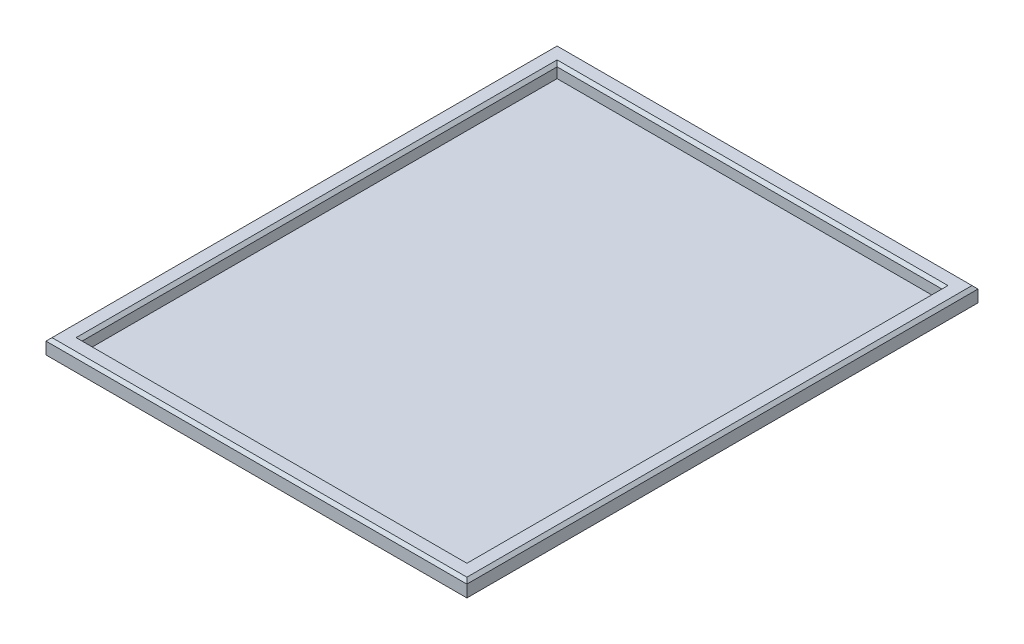
ISO-10303-21;
HEADER;
FILE_DESCRIPTION(('STEP AP214'),'2;1');
FILE_NAME('part.step','',(''),(''),'','','');
FILE_SCHEMA(('AUTOMOTIVE_DESIGN { 1 0 10303 214 1 1 1 1 }'));
ENDSEC;
DATA;
#1=APPLICATION_CONTEXT('core data for automotive mechanical design processes');
#2=APPLICATION_PROTOCOL_DEFINITION('international standard','automotive_design',2000,#1);
#3=PRODUCT_CONTEXT('',#1,'mechanical');
#4=PRODUCT('Part','Part','',(#3));
#5=PRODUCT_RELATED_PRODUCT_CATEGORY('part','',(#4));
#6=PRODUCT_DEFINITION_FORMATION('','',#4);
#7=PRODUCT_DEFINITION_CONTEXT('part definition',#1,'design');
#8=PRODUCT_DEFINITION('design','',#6,#7);
#9=PRODUCT_DEFINITION_SHAPE('','',#8);
#10=(LENGTH_UNIT() NAMED_UNIT(*) SI_UNIT(.MILLI.,.METRE.));
#11=(NAMED_UNIT(*) PLANE_ANGLE_UNIT() SI_UNIT($,.RADIAN.));
#12=(NAMED_UNIT(*) SI_UNIT($,.STERADIAN.) SOLID_ANGLE_UNIT());
#13=UNCERTAINTY_MEASURE_WITH_UNIT(LENGTH_MEASURE(1.E-05),#10,'distance_accuracy_value','');
#14=(GEOMETRIC_REPRESENTATION_CONTEXT(3) GLOBAL_UNCERTAINTY_ASSIGNED_CONTEXT((#13)) GLOBAL_UNIT_ASSIGNED_CONTEXT((#10,
#11,#12)) REPRESENTATION_CONTEXT('',''));
#15=CARTESIAN_POINT('',(0.,0.,0.));
#16=DIRECTION('',(0.,0.,1.));
#17=DIRECTION('',(1.,0.,0.));
#18=AXIS2_PLACEMENT_3D('',#15,#16,#17);
#19=CARTESIAN_POINT('',(-320.,8.,395.));
#20=DIRECTION('',(0.,0.,1.));
#21=DIRECTION('',(1.,0.,0.));
#22=AXIS2_PLACEMENT_3D('',#19,#20,#21);
#23=PLANE('',#22);
#24=DIRECTION('',(-1.,0.,0.));
#25=VECTOR('',#24,1.);
#26=CARTESIAN_POINT('',(-320.,0.,395.));
#27=LINE('',#26,#25);
#28=CARTESIAN_POINT('',(320.,0.,395.));
#29=VERTEX_POINT('',#28);
#30=CARTESIAN_POINT('',(-320.,0.,395.));
#31=VERTEX_POINT('',#30);
#32=EDGE_CURVE('E111',#29,#31,#27,.T.);
#33=ORIENTED_EDGE('',*,*,#32,.F.);
#34=DIRECTION('',(0.,-1.,0.));
#35=VECTOR('',#34,1.);
#36=CARTESIAN_POINT('',(320.,8.,395.));
#37=LINE('',#36,#35);
#38=CARTESIAN_POINT('',(320.,8.,395.));
#39=VERTEX_POINT('',#38);
#40=EDGE_CURVE('E12',#39,#29,#37,.T.);
#41=ORIENTED_EDGE('',*,*,#40,.F.);
#42=DIRECTION('',(-1.,0.,0.));
#43=VECTOR('',#42,1.);
#44=CARTESIAN_POINT('',(-320.,8.,395.));
#45=LINE('',#44,#43);
#46=CARTESIAN_POINT('',(-320.,8.,395.));
#47=VERTEX_POINT('',#46);
#48=EDGE_CURVE('E105',#39,#47,#45,.T.);
#49=ORIENTED_EDGE('',*,*,#48,.T.);
#50=DIRECTION('',(0.,-1.,0.));
#51=VECTOR('',#50,1.);
#52=CARTESIAN_POINT('',(-320.,8.,395.));
#53=LINE('',#52,#51);
#54=EDGE_CURVE('E50',#47,#31,#53,.T.);
#55=ORIENTED_EDGE('',*,*,#54,.T.);
#56=EDGE_LOOP('',(#33,#41,#49,#55));
#57=FACE_BOUND('',#56,.T.);
#58=ADVANCED_FACE('F47',(#57),#23,.T.);
#59=CARTESIAN_POINT('',(320.,8.,395.));
#60=DIRECTION('',(1.,0.,0.));
#61=DIRECTION('',(0.,0.,-1.));
#62=AXIS2_PLACEMENT_3D('',#59,#60,#61);
#63=PLANE('',#62);
#64=DIRECTION('',(0.,0.,1.));
#65=VECTOR('',#64,1.);
#66=CARTESIAN_POINT('',(320.,0.,395.));
#67=LINE('',#66,#65);
#68=CARTESIAN_POINT('',(320.,0.,-395.));
#69=VERTEX_POINT('',#68);
#70=EDGE_CURVE('E107',#69,#29,#67,.T.);
#71=ORIENTED_EDGE('',*,*,#70,.F.);
#72=DIRECTION('',(0.,-1.,0.));
#73=VECTOR('',#72,1.);
#74=CARTESIAN_POINT('',(320.,8.,-395.));
#75=LINE('',#74,#73);
#76=CARTESIAN_POINT('',(320.,8.,-395.));
#77=VERTEX_POINT('',#76);
#78=EDGE_CURVE('E56',#77,#69,#75,.T.);
#79=ORIENTED_EDGE('',*,*,#78,.F.);
#80=DIRECTION('',(0.,0.,1.));
#81=VECTOR('',#80,1.);
#82=CARTESIAN_POINT('',(320.,8.,395.));
#83=LINE('',#82,#81);
#84=EDGE_CURVE('E102',#77,#39,#83,.T.);
#85=ORIENTED_EDGE('',*,*,#84,.T.);
#86=ORIENTED_EDGE('',*,*,#40,.T.);
#87=EDGE_LOOP('',(#71,#79,#85,#86));
#88=FACE_BOUND('',#87,.T.);
#89=ADVANCED_FACE('F121',(#88),#63,.T.);
#90=CARTESIAN_POINT('',(320.,8.,-395.));
#91=DIRECTION('',(0.,0.,-1.));
#92=DIRECTION('',(-1.,0.,0.));
#93=AXIS2_PLACEMENT_3D('',#90,#91,#92);
#94=PLANE('',#93);
#95=DIRECTION('',(1.,0.,0.));
#96=VECTOR('',#95,1.);
#97=CARTESIAN_POINT('',(320.,0.,-395.));
#98=LINE('',#97,#96);
#99=CARTESIAN_POINT('',(-320.,0.,-395.));
#100=VERTEX_POINT('',#99);
#101=EDGE_CURVE('E97',#100,#69,#98,.T.);
#102=ORIENTED_EDGE('',*,*,#101,.F.);
#103=DIRECTION('',(0.,-1.,0.));
#104=VECTOR('',#103,1.);
#105=CARTESIAN_POINT('',(-320.,8.,-395.));
#106=LINE('',#105,#104);
#107=CARTESIAN_POINT('',(-320.,8.,-395.));
#108=VERTEX_POINT('',#107);
#109=EDGE_CURVE('E92',#108,#100,#106,.T.);
#110=ORIENTED_EDGE('',*,*,#109,.F.);
#111=DIRECTION('',(1.,0.,0.));
#112=VECTOR('',#111,1.);
#113=CARTESIAN_POINT('',(320.,8.,-395.));
#114=LINE('',#113,#112);
#115=EDGE_CURVE('E95',#108,#77,#114,.T.);
#116=ORIENTED_EDGE('',*,*,#115,.T.);
#117=ORIENTED_EDGE('',*,*,#78,.T.);
#118=EDGE_LOOP('',(#102,#110,#116,#117));
#119=FACE_BOUND('',#118,.T.);
#120=ADVANCED_FACE('F94',(#119),#94,.T.);
#121=CARTESIAN_POINT('',(-320.,8.,-395.));
#122=DIRECTION('',(-1.,0.,0.));
#123=DIRECTION('',(0.,0.,1.));
#124=AXIS2_PLACEMENT_3D('',#121,#122,#123);
#125=PLANE('',#124);
#126=DIRECTION('',(0.,0.,-1.));
#127=VECTOR('',#126,1.);
#128=CARTESIAN_POINT('',(-320.,0.,-395.));
#129=LINE('',#128,#127);
#130=EDGE_CURVE('E114',#31,#100,#129,.T.);
#131=ORIENTED_EDGE('',*,*,#130,.F.);
#132=ORIENTED_EDGE('',*,*,#54,.F.);
#133=DIRECTION('',(0.,0.,-1.));
#134=VECTOR('',#133,1.);
#135=CARTESIAN_POINT('',(-320.,8.,-395.));
#136=LINE('',#135,#134);
#137=EDGE_CURVE('E101',#47,#108,#136,.T.);
#138=ORIENTED_EDGE('',*,*,#137,.T.);
#139=ORIENTED_EDGE('',*,*,#109,.T.);
#140=EDGE_LOOP('',(#131,#132,#138,#139));
#141=FACE_BOUND('',#140,.T.);
#142=ADVANCED_FACE('F104',(#141),#125,.T.);
#143=CARTESIAN_POINT('',(0.,8.,0.));
#144=DIRECTION('',(0.,1.,0.));
#145=DIRECTION('',(0.,0.,1.));
#146=AXIS2_PLACEMENT_3D('',#143,#144,#145);
#147=PLANE('',#146);
#148=ORIENTED_EDGE('',*,*,#48,.F.);
#149=ORIENTED_EDGE('',*,*,#84,.F.);
#150=ORIENTED_EDGE('',*,*,#115,.F.);
#151=ORIENTED_EDGE('',*,*,#137,.F.);
#152=EDGE_LOOP('',(#148,#149,#150,#151));
#153=FACE_BOUND('',#152,.T.);
#154=ADVANCED_FACE('F100',(#153),#147,.T.);
#155=CARTESIAN_POINT('',(0.,0.,0.));
#156=DIRECTION('',(0.,1.,0.));
#157=DIRECTION('',(0.,0.,1.));
#158=AXIS2_PLACEMENT_3D('',#155,#156,#157);
#159=PLANE('',#158);
#160=ORIENTED_EDGE('',*,*,#32,.T.);
#161=ORIENTED_EDGE('',*,*,#130,.T.);
#162=ORIENTED_EDGE('',*,*,#101,.T.);
#163=ORIENTED_EDGE('',*,*,#70,.T.);
#164=EDGE_LOOP('',(#160,#161,#162,#163));
#165=FACE_BOUND('',#164,.T.);
#166=ADVANCED_FACE('F120',(#165),#159,.F.);
#167=CLOSED_SHELL('',(#58,#89,#120,#142,#154,#166));
#168=MANIFOLD_SOLID_BREP('B2',#167);
#169=CARTESIAN_POINT('',(0.,30.,0.));
#170=DIRECTION('',(0.,-1.,0.));
#171=DIRECTION('',(0.,0.,-1.));
#172=AXIS2_PLACEMENT_3D('',#169,#170,#171);
#173=PLANE('',#172);
#174=DIRECTION('',(0.,0.,1.));
#175=VECTOR('',#174,1.);
#176=CARTESIAN_POINT('',(325.,30.,395.));
#177=LINE('',#176,#175);
#178=CARTESIAN_POINT('',(325.,30.,-400.));
#179=VERTEX_POINT('',#178);
#180=CARTESIAN_POINT('',(325.,30.,400.));
#181=VERTEX_POINT('',#180);
#182=EDGE_CURVE('E339',#179,#181,#177,.T.);
#183=ORIENTED_EDGE('',*,*,#182,.T.);
#184=DIRECTION('',(-1.,0.,0.));
#185=VECTOR('',#184,1.);
#186=CARTESIAN_POINT('',(-320.,30.,400.));
#187=LINE('',#186,#185);
#188=CARTESIAN_POINT('',(-325.,30.,400.));
#189=VERTEX_POINT('',#188);
#190=EDGE_CURVE('E341',#181,#189,#187,.T.);
#191=ORIENTED_EDGE('',*,*,#190,.T.);
#192=DIRECTION('',(0.,0.,-1.));
#193=VECTOR('',#192,1.);
#194=CARTESIAN_POINT('',(-325.,30.,-395.));
#195=LINE('',#194,#193);
#196=CARTESIAN_POINT('',(-325.,30.,-400.));
#197=VERTEX_POINT('',#196);
#198=EDGE_CURVE('E335',#189,#197,#195,.T.);
#199=ORIENTED_EDGE('',*,*,#198,.T.);
#200=DIRECTION('',(1.,0.,0.));
#201=VECTOR('',#200,1.);
#202=CARTESIAN_POINT('',(320.,30.,-400.));
#203=LINE('',#202,#201);
#204=EDGE_CURVE('E337',#197,#179,#203,.T.);
#205=ORIENTED_EDGE('',*,*,#204,.T.);
#206=EDGE_LOOP('',(#183,#191,#199,#205));
#207=FACE_BOUND('',#206,.T.);
#208=DIRECTION('',(0.,0.,1.));
#209=VECTOR('',#208,1.);
#210=CARTESIAN_POINT('',(-345.,30.,0.));
#211=LINE('',#210,#209);
#212=CARTESIAN_POINT('',(-345.,30.,-420.));
#213=VERTEX_POINT('',#212);
#214=CARTESIAN_POINT('',(-345.,30.,420.));
#215=VERTEX_POINT('',#214);
#216=EDGE_CURVE('E330',#213,#215,#211,.T.);
#217=ORIENTED_EDGE('',*,*,#216,.T.);
#218=DIRECTION('',(1.,0.,0.));
#219=VECTOR('',#218,1.);
#220=CARTESIAN_POINT('',(0.,30.,420.));
#221=LINE('',#220,#219);
#222=CARTESIAN_POINT('',(345.,30.,420.));
#223=VERTEX_POINT('',#222);
#224=EDGE_CURVE('E332',#215,#223,#221,.T.);
#225=ORIENTED_EDGE('',*,*,#224,.T.);
#226=DIRECTION('',(0.,0.,-1.));
#227=VECTOR('',#226,1.);
#228=CARTESIAN_POINT('',(345.,30.,0.));
#229=LINE('',#228,#227);
#230=CARTESIAN_POINT('',(345.,30.,-420.));
#231=VERTEX_POINT('',#230);
#232=EDGE_CURVE('E326',#223,#231,#229,.T.);
#233=ORIENTED_EDGE('',*,*,#232,.T.);
#234=DIRECTION('',(-1.,0.,0.));
#235=VECTOR('',#234,1.);
#236=CARTESIAN_POINT('',(0.,30.,-420.));
#237=LINE('',#236,#235);
#238=EDGE_CURVE('E328',#231,#213,#237,.T.);
#239=ORIENTED_EDGE('',*,*,#238,.T.);
#240=EDGE_LOOP('',(#217,#225,#233,#239));
#241=FACE_BOUND('',#240,.T.);
#242=ADVANCED_FACE('F171',(#207,#241),#173,.F.);
#243=CARTESIAN_POINT('',(0.,0.,0.));
#244=DIRECTION('',(0.,-1.,0.));
#245=DIRECTION('',(0.,0.,-1.));
#246=AXIS2_PLACEMENT_3D('',#243,#244,#245);
#247=PLANE('',#246);
#248=DIRECTION('',(1.,0.,0.));
#249=VECTOR('',#248,1.);
#250=CARTESIAN_POINT('',(350.,0.,-420.));
#251=LINE('',#250,#249);
#252=CARTESIAN_POINT('',(-345.,0.,-420.));
#253=VERTEX_POINT('',#252);
#254=CARTESIAN_POINT('',(345.,0.,-420.));
#255=VERTEX_POINT('',#254);
#256=EDGE_CURVE('E181',#253,#255,#251,.T.);
#257=ORIENTED_EDGE('',*,*,#256,.T.);
#258=DIRECTION('',(0.,0.,1.));
#259=VECTOR('',#258,1.);
#260=CARTESIAN_POINT('',(345.,0.,425.));
#261=LINE('',#260,#259);
#262=CARTESIAN_POINT('',(345.,0.,420.));
#263=VERTEX_POINT('',#262);
#264=EDGE_CURVE('E45',#255,#263,#261,.T.);
#265=ORIENTED_EDGE('',*,*,#264,.T.);
#266=DIRECTION('',(-1.,0.,0.));
#267=VECTOR('',#266,1.);
#268=CARTESIAN_POINT('',(-350.,0.,420.));
#269=LINE('',#268,#267);
#270=CARTESIAN_POINT('',(-345.,0.,420.));
#271=VERTEX_POINT('',#270);
#272=EDGE_CURVE('E367',#263,#271,#269,.T.);
#273=ORIENTED_EDGE('',*,*,#272,.T.);
#274=DIRECTION('',(0.,0.,-1.));
#275=VECTOR('',#274,1.);
#276=CARTESIAN_POINT('',(-345.,0.,-425.));
#277=LINE('',#276,#275);
#278=EDGE_CURVE('E192',#271,#253,#277,.T.);
#279=ORIENTED_EDGE('',*,*,#278,.T.);
#280=EDGE_LOOP('',(#257,#265,#273,#279));
#281=FACE_BOUND('',#280,.T.);
#282=DIRECTION('',(-1.,0.,0.));
#283=VECTOR('',#282,1.);
#284=CARTESIAN_POINT('',(-320.,0.,-395.));
#285=LINE('',#284,#283);
#286=CARTESIAN_POINT('',(320.,0.,-395.));
#287=VERTEX_POINT('',#286);
#288=CARTESIAN_POINT('',(-320.,0.,-395.));
#289=VERTEX_POINT('',#288);
#290=EDGE_CURVE('E299',#287,#289,#285,.T.);
#291=ORIENTED_EDGE('',*,*,#290,.T.);
#292=DIRECTION('',(0.,0.,1.));
#293=VECTOR('',#292,1.);
#294=CARTESIAN_POINT('',(-320.,0.,395.));
#295=LINE('',#294,#293);
#296=CARTESIAN_POINT('',(-320.,0.,395.));
#297=VERTEX_POINT('',#296);
#298=EDGE_CURVE('E278',#289,#297,#295,.T.);
#299=ORIENTED_EDGE('',*,*,#298,.T.);
#300=DIRECTION('',(1.,0.,0.));
#301=VECTOR('',#300,1.);
#302=CARTESIAN_POINT('',(-320.,0.,395.));
#303=LINE('',#302,#301);
#304=CARTESIAN_POINT('',(320.,0.,395.));
#305=VERTEX_POINT('',#304);
#306=EDGE_CURVE('E289',#297,#305,#303,.T.);
#307=ORIENTED_EDGE('',*,*,#306,.T.);
#308=DIRECTION('',(0.,0.,-1.));
#309=VECTOR('',#308,1.);
#310=CARTESIAN_POINT('',(320.,0.,395.));
#311=LINE('',#310,#309);
#312=EDGE_CURVE('E295',#305,#287,#311,.T.);
#313=ORIENTED_EDGE('',*,*,#312,.T.);
#314=EDGE_LOOP('',(#291,#299,#307,#313));
#315=FACE_BOUND('',#314,.T.);
#316=ADVANCED_FACE('F297',(#281,#315),#247,.T.);
#317=CARTESIAN_POINT('',(350.,30.,425.));
#318=DIRECTION('',(-1.,0.,0.));
#319=DIRECTION('',(0.,0.,1.));
#320=AXIS2_PLACEMENT_3D('',#317,#318,#319);
#321=PLANE('',#320);
#322=DIRECTION('',(0.,-1.,0.));
#323=VECTOR('',#322,1.);
#324=CARTESIAN_POINT('',(350.,30.,-425.));
#325=LINE('',#324,#323);
#326=CARTESIAN_POINT('',(350.,24.9999999999998,-425.));
#327=VERTEX_POINT('',#326);
#328=CARTESIAN_POINT('',(350.,5.,-425.));
#329=VERTEX_POINT('',#328);
#330=EDGE_CURVE('E321',#327,#329,#325,.T.);
#331=ORIENTED_EDGE('',*,*,#330,.F.);
#332=DIRECTION('',(0.,0.,1.));
#333=VECTOR('',#332,1.);
#334=CARTESIAN_POINT('',(350.,24.9999999999998,425.));
#335=LINE('',#334,#333);
#336=CARTESIAN_POINT('',(350.,24.9999999999998,425.));
#337=VERTEX_POINT('',#336);
#338=EDGE_CURVE('E365',#327,#337,#335,.T.);
#339=ORIENTED_EDGE('',*,*,#338,.T.);
#340=DIRECTION('',(0.,-1.,0.));
#341=VECTOR('',#340,1.);
#342=CARTESIAN_POINT('',(350.,30.,425.));
#343=LINE('',#342,#341);
#344=CARTESIAN_POINT('',(350.,5.,425.));
#345=VERTEX_POINT('',#344);
#346=EDGE_CURVE('E285',#337,#345,#343,.T.);
#347=ORIENTED_EDGE('',*,*,#346,.T.);
#348=DIRECTION('',(0.,0.,-1.));
#349=VECTOR('',#348,1.);
#350=CARTESIAN_POINT('',(350.,5.,-425.));
#351=LINE('',#350,#349);
#352=EDGE_CURVE('E362',#345,#329,#351,.T.);
#353=ORIENTED_EDGE('',*,*,#352,.T.);
#354=EDGE_LOOP('',(#331,#339,#347,#353));
#355=FACE_BOUND('',#354,.T.);
#356=ADVANCED_FACE('F409',(#355),#321,.F.);
#357=CARTESIAN_POINT('',(-350.,30.,-425.));
#358=DIRECTION('',(0.,0.,1.));
#359=DIRECTION('',(1.,0.,0.));
#360=AXIS2_PLACEMENT_3D('',#357,#358,#359);
#361=PLANE('',#360);
#362=DIRECTION('',(0.,-1.,0.));
#363=VECTOR('',#362,1.);
#364=CARTESIAN_POINT('',(-350.,30.,-425.));
#365=LINE('',#364,#363);
#366=CARTESIAN_POINT('',(-350.,24.9999999999998,-425.));
#367=VERTEX_POINT('',#366);
#368=CARTESIAN_POINT('',(-350.,5.,-425.));
#369=VERTEX_POINT('',#368);
#370=EDGE_CURVE('E318',#367,#369,#365,.T.);
#371=ORIENTED_EDGE('',*,*,#370,.F.);
#372=DIRECTION('',(1.,0.,0.));
#373=VECTOR('',#372,1.);
#374=CARTESIAN_POINT('',(-350.,24.9999999999998,-425.));
#375=LINE('',#374,#373);
#376=EDGE_CURVE('E360',#367,#327,#375,.T.);
#377=ORIENTED_EDGE('',*,*,#376,.T.);
#378=ORIENTED_EDGE('',*,*,#330,.T.);
#379=DIRECTION('',(-1.,0.,0.));
#380=VECTOR('',#379,1.);
#381=CARTESIAN_POINT('',(-350.,5.,-425.));
#382=LINE('',#381,#380);
#383=EDGE_CURVE('E358',#329,#369,#382,.T.);
#384=ORIENTED_EDGE('',*,*,#383,.T.);
#385=EDGE_LOOP('',(#371,#377,#378,#384));
#386=FACE_BOUND('',#385,.T.);
#387=ADVANCED_FACE('F415',(#386),#361,.F.);
#388=CARTESIAN_POINT('',(-350.,30.,425.));
#389=DIRECTION('',(1.,0.,0.));
#390=DIRECTION('',(0.,0.,-1.));
#391=AXIS2_PLACEMENT_3D('',#388,#389,#390);
#392=PLANE('',#391);
#393=DIRECTION('',(0.,-1.,0.));
#394=VECTOR('',#393,1.);
#395=CARTESIAN_POINT('',(-350.,30.,425.));
#396=LINE('',#395,#394);
#397=CARTESIAN_POINT('',(-350.,24.9999999999998,425.));
#398=VERTEX_POINT('',#397);
#399=CARTESIAN_POINT('',(-350.,5.,425.));
#400=VERTEX_POINT('',#399);
#401=EDGE_CURVE('E315',#398,#400,#396,.T.);
#402=ORIENTED_EDGE('',*,*,#401,.F.);
#403=DIRECTION('',(0.,0.,-1.));
#404=VECTOR('',#403,1.);
#405=CARTESIAN_POINT('',(-350.,24.9999999999998,425.));
#406=LINE('',#405,#404);
#407=EDGE_CURVE('E356',#398,#367,#406,.T.);
#408=ORIENTED_EDGE('',*,*,#407,.T.);
#409=ORIENTED_EDGE('',*,*,#370,.T.);
#410=DIRECTION('',(0.,0.,1.));
#411=VECTOR('',#410,1.);
#412=CARTESIAN_POINT('',(-350.,5.,425.));
#413=LINE('',#412,#411);
#414=EDGE_CURVE('E354',#369,#400,#413,.T.);
#415=ORIENTED_EDGE('',*,*,#414,.T.);
#416=EDGE_LOOP('',(#402,#408,#409,#415));
#417=FACE_BOUND('',#416,.T.);
#418=ADVANCED_FACE('F425',(#417),#392,.F.);
#419=CARTESIAN_POINT('',(-350.,30.,425.));
#420=DIRECTION('',(0.,0.,-1.));
#421=DIRECTION('',(-1.,0.,0.));
#422=AXIS2_PLACEMENT_3D('',#419,#420,#421);
#423=PLANE('',#422);
#424=ORIENTED_EDGE('',*,*,#346,.F.);
#425=DIRECTION('',(-1.,0.,0.));
#426=VECTOR('',#425,1.);
#427=CARTESIAN_POINT('',(-350.,24.9999999999998,425.));
#428=LINE('',#427,#426);
#429=EDGE_CURVE('E351',#337,#398,#428,.T.);
#430=ORIENTED_EDGE('',*,*,#429,.T.);
#431=ORIENTED_EDGE('',*,*,#401,.T.);
#432=DIRECTION('',(1.,0.,0.));
#433=VECTOR('',#432,1.);
#434=CARTESIAN_POINT('',(350.,5.,425.));
#435=LINE('',#434,#433);
#436=EDGE_CURVE('E349',#400,#345,#435,.T.);
#437=ORIENTED_EDGE('',*,*,#436,.T.);
#438=EDGE_LOOP('',(#424,#430,#431,#437));
#439=FACE_BOUND('',#438,.T.);
#440=ADVANCED_FACE('F422',(#439),#423,.F.);
#441=CARTESIAN_POINT('',(-320.,30.,395.));
#442=DIRECTION('',(1.,0.,0.));
#443=DIRECTION('',(0.,0.,-1.));
#444=AXIS2_PLACEMENT_3D('',#441,#442,#443);
#445=PLANE('',#444);
#446=DIRECTION('',(0.,-1.,0.));
#447=VECTOR('',#446,1.);
#448=CARTESIAN_POINT('',(-320.,30.,-395.));
#449=LINE('',#448,#447);
#450=CARTESIAN_POINT('',(-320.,25.0000000000002,-395.));
#451=VERTEX_POINT('',#450);
#452=EDGE_CURVE('E308',#451,#289,#449,.T.);
#453=ORIENTED_EDGE('',*,*,#452,.F.);
#454=DIRECTION('',(0.,0.,1.));
#455=VECTOR('',#454,1.);
#456=CARTESIAN_POINT('',(-320.,25.0000000000002,395.));
#457=LINE('',#456,#455);
#458=CARTESIAN_POINT('',(-320.,25.0000000000002,395.));
#459=VERTEX_POINT('',#458);
#460=EDGE_CURVE('E281',#451,#459,#457,.T.);
#461=ORIENTED_EDGE('',*,*,#460,.T.);
#462=DIRECTION('',(0.,-1.,0.));
#463=VECTOR('',#462,1.);
#464=CARTESIAN_POINT('',(-320.,30.,395.));
#465=LINE('',#464,#463);
#466=EDGE_CURVE('E273',#459,#297,#465,.T.);
#467=ORIENTED_EDGE('',*,*,#466,.T.);
#468=ORIENTED_EDGE('',*,*,#298,.F.);
#469=EDGE_LOOP('',(#453,#461,#467,#468));
#470=FACE_BOUND('',#469,.T.);
#471=ADVANCED_FACE('F276',(#470),#445,.T.);
#472=CARTESIAN_POINT('',(-320.,30.,395.));
#473=DIRECTION('',(0.,0.,-1.));
#474=DIRECTION('',(-1.,0.,0.));
#475=AXIS2_PLACEMENT_3D('',#472,#473,#474);
#476=PLANE('',#475);
#477=ORIENTED_EDGE('',*,*,#466,.F.);
#478=DIRECTION('',(1.,0.,0.));
#479=VECTOR('',#478,1.);
#480=CARTESIAN_POINT('',(320.,25.0000000000002,395.));
#481=LINE('',#480,#479);
#482=CARTESIAN_POINT('',(320.,25.0000000000002,395.));
#483=VERTEX_POINT('',#482);
#484=EDGE_CURVE('E324',#459,#483,#481,.T.);
#485=ORIENTED_EDGE('',*,*,#484,.T.);
#486=DIRECTION('',(0.,-1.,0.));
#487=VECTOR('',#486,1.);
#488=CARTESIAN_POINT('',(320.,30.,395.));
#489=LINE('',#488,#487);
#490=EDGE_CURVE('E286',#483,#305,#489,.T.);
#491=ORIENTED_EDGE('',*,*,#490,.T.);
#492=ORIENTED_EDGE('',*,*,#306,.F.);
#493=EDGE_LOOP('',(#477,#485,#491,#492));
#494=FACE_BOUND('',#493,.T.);
#495=ADVANCED_FACE('F290',(#494),#476,.T.);
#496=CARTESIAN_POINT('',(320.,30.,395.));
#497=DIRECTION('',(-1.,0.,0.));
#498=DIRECTION('',(0.,0.,1.));
#499=AXIS2_PLACEMENT_3D('',#496,#497,#498);
#500=PLANE('',#499);
#501=ORIENTED_EDGE('',*,*,#490,.F.);
#502=DIRECTION('',(0.,0.,-1.));
#503=VECTOR('',#502,1.);
#504=CARTESIAN_POINT('',(320.,25.0000000000002,-395.));
#505=LINE('',#504,#503);
#506=CARTESIAN_POINT('',(320.,25.0000000000002,-395.));
#507=VERTEX_POINT('',#506);
#508=EDGE_CURVE('E344',#483,#507,#505,.T.);
#509=ORIENTED_EDGE('',*,*,#508,.T.);
#510=DIRECTION('',(0.,-1.,0.));
#511=VECTOR('',#510,1.);
#512=CARTESIAN_POINT('',(320.,30.,-395.));
#513=LINE('',#512,#511);
#514=EDGE_CURVE('E310',#507,#287,#513,.T.);
#515=ORIENTED_EDGE('',*,*,#514,.T.);
#516=ORIENTED_EDGE('',*,*,#312,.F.);
#517=EDGE_LOOP('',(#501,#509,#515,#516));
#518=FACE_BOUND('',#517,.T.);
#519=ADVANCED_FACE('F546',(#518),#500,.T.);
#520=CARTESIAN_POINT('',(-320.,30.,-395.));
#521=DIRECTION('',(0.,0.,1.));
#522=DIRECTION('',(1.,0.,0.));
#523=AXIS2_PLACEMENT_3D('',#520,#521,#522);
#524=PLANE('',#523);
#525=ORIENTED_EDGE('',*,*,#514,.F.);
#526=DIRECTION('',(-1.,0.,0.));
#527=VECTOR('',#526,1.);
#528=CARTESIAN_POINT('',(-320.,25.0000000000002,-395.));
#529=LINE('',#528,#527);
#530=EDGE_CURVE('E346',#507,#451,#529,.T.);
#531=ORIENTED_EDGE('',*,*,#530,.T.);
#532=ORIENTED_EDGE('',*,*,#452,.T.);
#533=ORIENTED_EDGE('',*,*,#290,.F.);
#534=EDGE_LOOP('',(#525,#531,#532,#533));
#535=FACE_BOUND('',#534,.T.);
#536=ADVANCED_FACE('F462',(#535),#524,.T.);
#537=CARTESIAN_POINT('',(-320.,25.0000000000002,-395.));
#538=DIRECTION('',(0.,0.707106781186553,0.707106781186542));
#539=DIRECTION('',(1.,0.,0.));
#540=AXIS2_PLACEMENT_3D('',#537,#538,#539);
#541=PLANE('',#540);
#542=DIRECTION('',(0.577350269189625,0.577350269189621,-0.577350269189631));
#543=VECTOR('',#542,1.);
#544=CARTESIAN_POINT('',(56.6666666666647,-238.333333333334,-131.666666666662));
#545=LINE('',#544,#543);
#546=EDGE_CURVE('E303',#179,#507,#545,.F.);
#547=ORIENTED_EDGE('',*,*,#546,.F.);
#548=ORIENTED_EDGE('',*,*,#204,.F.);
#549=DIRECTION('',(-0.577350269189631,0.577350269189618,-0.577350269189628));
#550=VECTOR('',#549,1.);
#551=CARTESIAN_POINT('',(-320.,25.0000000000002,-395.));
#552=LINE('',#551,#550);
#553=EDGE_CURVE('E300',#451,#197,#552,.T.);
#554=ORIENTED_EDGE('',*,*,#553,.F.);
#555=ORIENTED_EDGE('',*,*,#530,.F.);
#556=EDGE_LOOP('',(#547,#548,#554,#555));
#557=FACE_BOUND('',#556,.T.);
#558=ADVANCED_FACE('F456',(#557),#541,.T.);
#559=CARTESIAN_POINT('',(-320.,25.0000000000002,395.));
#560=DIRECTION('',(0.70710678118654,0.707106781186555,0.));
#561=DIRECTION('',(0.,0.,-1.));
#562=AXIS2_PLACEMENT_3D('',#559,#560,#561);
#563=PLANE('',#562);
#564=ORIENTED_EDGE('',*,*,#553,.T.);
#565=ORIENTED_EDGE('',*,*,#198,.F.);
#566=DIRECTION('',(0.57735026918963,-0.577350269189617,-0.57735026918963));
#567=VECTOR('',#566,1.);
#568=CARTESIAN_POINT('',(-320.,25.0000000000002,395.));
#569=LINE('',#568,#567);
#570=EDGE_CURVE('E373',#459,#189,#569,.F.);
#571=ORIENTED_EDGE('',*,*,#570,.F.);
#572=ORIENTED_EDGE('',*,*,#460,.F.);
#573=EDGE_LOOP('',(#564,#565,#571,#572));
#574=FACE_BOUND('',#573,.T.);
#575=ADVANCED_FACE('F449',(#574),#563,.T.);
#576=CARTESIAN_POINT('',(320.,25.0000000000002,395.));
#577=DIRECTION('',(-0.707106781186545,0.707106781186549,0.));
#578=DIRECTION('',(0.,0.,1.));
#579=AXIS2_PLACEMENT_3D('',#576,#577,#578);
#580=PLANE('',#579);
#581=ORIENTED_EDGE('',*,*,#546,.T.);
#582=ORIENTED_EDGE('',*,*,#508,.F.);
#583=DIRECTION('',(0.577350269189624,0.57735026918962,0.577350269189633));
#584=VECTOR('',#583,1.);
#585=CARTESIAN_POINT('',(106.666666666668,-188.33333333333,181.666666666665));
#586=LINE('',#585,#584);
#587=EDGE_CURVE('E371',#181,#483,#586,.F.);
#588=ORIENTED_EDGE('',*,*,#587,.F.);
#589=ORIENTED_EDGE('',*,*,#182,.F.);
#590=EDGE_LOOP('',(#581,#582,#588,#589));
#591=FACE_BOUND('',#590,.T.);
#592=ADVANCED_FACE('F442',(#591),#580,.T.);
#593=CARTESIAN_POINT('',(-320.,25.0000000000002,395.));
#594=DIRECTION('',(0.,0.707106781186555,-0.70710678118654));
#595=DIRECTION('',(-1.,0.,0.));
#596=AXIS2_PLACEMENT_3D('',#593,#594,#595);
#597=PLANE('',#596);
#598=ORIENTED_EDGE('',*,*,#570,.T.);
#599=ORIENTED_EDGE('',*,*,#190,.F.);
#600=ORIENTED_EDGE('',*,*,#587,.T.);
#601=ORIENTED_EDGE('',*,*,#484,.F.);
#602=EDGE_LOOP('',(#598,#599,#600,#601));
#603=FACE_BOUND('',#602,.T.);
#604=ADVANCED_FACE('F434',(#603),#597,.T.);
#605=CARTESIAN_POINT('',(0.,30.,-420.));
#606=DIRECTION('',(0.,-0.707106781186548,0.707106781186548));
#607=DIRECTION('',(-1.,0.,0.));
#608=AXIS2_PLACEMENT_3D('',#605,#606,#607);
#609=PLANE('',#608);
#610=DIRECTION('',(-0.577350269189626,0.577350269189626,0.577350269189626));
#611=VECTOR('',#610,1.);
#612=CARTESIAN_POINT('',(205.,170.,-280.));
#613=LINE('',#612,#611);
#614=EDGE_CURVE('E382',#327,#231,#613,.T.);
#615=ORIENTED_EDGE('',*,*,#614,.F.);
#616=ORIENTED_EDGE('',*,*,#376,.F.);
#617=DIRECTION('',(0.577350269189626,0.577350269189626,0.577350269189626));
#618=VECTOR('',#617,1.);
#619=CARTESIAN_POINT('',(-230.,145.,-305.));
#620=LINE('',#619,#618);
#621=EDGE_CURVE('E374',#213,#367,#620,.F.);
#622=ORIENTED_EDGE('',*,*,#621,.F.);
#623=ORIENTED_EDGE('',*,*,#238,.F.);
#624=EDGE_LOOP('',(#615,#616,#622,#623));
#625=FACE_BOUND('',#624,.T.);
#626=ADVANCED_FACE('F441',(#625),#609,.F.);
#627=CARTESIAN_POINT('',(-345.,30.,0.));
#628=DIRECTION('',(0.707106781186548,-0.707106781186548,0.));
#629=DIRECTION('',(0.,0.,1.));
#630=AXIS2_PLACEMENT_3D('',#627,#628,#629);
#631=PLANE('',#630);
#632=ORIENTED_EDGE('',*,*,#621,.T.);
#633=ORIENTED_EDGE('',*,*,#407,.F.);
#634=DIRECTION('',(0.577350269189626,0.577350269189626,-0.577350269189626));
#635=VECTOR('',#634,1.);
#636=CARTESIAN_POINT('',(-205.,170.,280.));
#637=LINE('',#636,#635);
#638=EDGE_CURVE('E380',#215,#398,#637,.F.);
#639=ORIENTED_EDGE('',*,*,#638,.F.);
#640=ORIENTED_EDGE('',*,*,#216,.F.);
#641=EDGE_LOOP('',(#632,#633,#639,#640));
#642=FACE_BOUND('',#641,.T.);
#643=ADVANCED_FACE('F478',(#642),#631,.F.);
#644=CARTESIAN_POINT('',(345.,30.,0.));
#645=DIRECTION('',(-0.707106781186548,-0.707106781186548,0.));
#646=DIRECTION('',(0.,0.,-1.));
#647=AXIS2_PLACEMENT_3D('',#644,#645,#646);
#648=PLANE('',#647);
#649=ORIENTED_EDGE('',*,*,#614,.T.);
#650=ORIENTED_EDGE('',*,*,#232,.F.);
#651=DIRECTION('',(0.577350269189626,-0.577350269189626,0.577350269189626));
#652=VECTOR('',#651,1.);
#653=CARTESIAN_POINT('',(205.,170.,280.));
#654=LINE('',#653,#652);
#655=EDGE_CURVE('E378',#337,#223,#654,.F.);
#656=ORIENTED_EDGE('',*,*,#655,.F.);
#657=ORIENTED_EDGE('',*,*,#338,.F.);
#658=EDGE_LOOP('',(#649,#650,#656,#657));
#659=FACE_BOUND('',#658,.T.);
#660=ADVANCED_FACE('F471',(#659),#648,.F.);
#661=CARTESIAN_POINT('',(0.,30.,420.));
#662=DIRECTION('',(0.,-0.707106781186548,-0.707106781186548));
#663=DIRECTION('',(1.,0.,0.));
#664=AXIS2_PLACEMENT_3D('',#661,#662,#663);
#665=PLANE('',#664);
#666=ORIENTED_EDGE('',*,*,#638,.T.);
#667=ORIENTED_EDGE('',*,*,#429,.F.);
#668=ORIENTED_EDGE('',*,*,#655,.T.);
#669=ORIENTED_EDGE('',*,*,#224,.F.);
#670=EDGE_LOOP('',(#666,#667,#668,#669));
#671=FACE_BOUND('',#670,.T.);
#672=ADVANCED_FACE('F465',(#671),#665,.F.);
#673=CARTESIAN_POINT('',(-350.,5.,425.));
#674=DIRECTION('',(-0.707106781186547,-0.707106781186547,0.));
#675=DIRECTION('',(0.,0.,-1.));
#676=AXIS2_PLACEMENT_3D('',#673,#674,#675);
#677=PLANE('',#676);
#678=DIRECTION('',(0.577350269189626,-0.577350269189626,0.577350269189626));
#679=VECTOR('',#678,1.);
#680=CARTESIAN_POINT('',(-66.6666666666665,-278.333333333333,-141.666666666667));
#681=LINE('',#680,#679);
#682=EDGE_CURVE('E390',#253,#369,#681,.F.);
#683=ORIENTED_EDGE('',*,*,#682,.F.);
#684=ORIENTED_EDGE('',*,*,#278,.F.);
#685=DIRECTION('',(0.577350269189626,-0.577350269189626,-0.577350269189626));
#686=VECTOR('',#685,1.);
#687=CARTESIAN_POINT('',(-350.,5.,425.));
#688=LINE('',#687,#686);
#689=EDGE_CURVE('E176',#400,#271,#688,.T.);
#690=ORIENTED_EDGE('',*,*,#689,.F.);
#691=ORIENTED_EDGE('',*,*,#414,.F.);
#692=EDGE_LOOP('',(#683,#684,#690,#691));
#693=FACE_BOUND('',#692,.T.);
#694=ADVANCED_FACE('F174',(#693),#677,.T.);
#695=CARTESIAN_POINT('',(-350.,5.,425.));
#696=DIRECTION('',(0.,-0.707106781186547,0.707106781186547));
#697=DIRECTION('',(-1.,0.,0.));
#698=AXIS2_PLACEMENT_3D('',#695,#696,#697);
#699=PLANE('',#698);
#700=ORIENTED_EDGE('',*,*,#689,.T.);
#701=ORIENTED_EDGE('',*,*,#272,.F.);
#702=DIRECTION('',(0.577350269189626,0.577350269189626,0.577350269189626));
#703=VECTOR('',#702,1.);
#704=CARTESIAN_POINT('',(116.666666666667,-228.333333333333,191.666666666667));
#705=LINE('',#704,#703);
#706=EDGE_CURVE('E389',#345,#263,#705,.F.);
#707=ORIENTED_EDGE('',*,*,#706,.F.);
#708=ORIENTED_EDGE('',*,*,#436,.F.);
#709=EDGE_LOOP('',(#700,#701,#707,#708));
#710=FACE_BOUND('',#709,.T.);
#711=ADVANCED_FACE('F399',(#710),#699,.T.);
#712=CARTESIAN_POINT('',(-350.,5.,-425.));
#713=DIRECTION('',(0.,-0.707106781186547,-0.707106781186547));
#714=DIRECTION('',(1.,0.,0.));
#715=AXIS2_PLACEMENT_3D('',#712,#713,#714);
#716=PLANE('',#715);
#717=ORIENTED_EDGE('',*,*,#682,.T.);
#718=ORIENTED_EDGE('',*,*,#383,.F.);
#719=DIRECTION('',(-0.577350269189626,-0.577350269189626,0.577350269189626));
#720=VECTOR('',#719,1.);
#721=CARTESIAN_POINT('',(116.666666666667,-228.333333333333,-191.666666666667));
#722=LINE('',#721,#720);
#723=EDGE_CURVE('E387',#255,#329,#722,.F.);
#724=ORIENTED_EDGE('',*,*,#723,.F.);
#725=ORIENTED_EDGE('',*,*,#256,.F.);
#726=EDGE_LOOP('',(#717,#718,#724,#725));
#727=FACE_BOUND('',#726,.T.);
#728=ADVANCED_FACE('F404',(#727),#716,.T.);
#729=CARTESIAN_POINT('',(350.,5.,425.));
#730=DIRECTION('',(0.707106781186547,-0.707106781186547,0.));
#731=DIRECTION('',(0.,0.,1.));
#732=AXIS2_PLACEMENT_3D('',#729,#730,#731);
#733=PLANE('',#732);
#734=ORIENTED_EDGE('',*,*,#706,.T.);
#735=ORIENTED_EDGE('',*,*,#264,.F.);
#736=ORIENTED_EDGE('',*,*,#723,.T.);
#737=ORIENTED_EDGE('',*,*,#352,.F.);
#738=EDGE_LOOP('',(#734,#735,#736,#737));
#739=FACE_BOUND('',#738,.T.);
#740=ADVANCED_FACE('F407',(#739),#733,.T.);
#741=CLOSED_SHELL('',(#242,#316,#356,#387,#418,#440,#471,#495,#519,#536,#558,#575,#592,#604,
#626,#643,#660,#672,#694,#711,#728,#740));
#742=MANIFOLD_SOLID_BREP('B6',#741);
#743=ADVANCED_BREP_SHAPE_REPRESENTATION('',(#18,#168,#742),#14);
#744=SHAPE_DEFINITION_REPRESENTATION(#9,#743);
ENDSEC;
END-ISO-10303-21;
